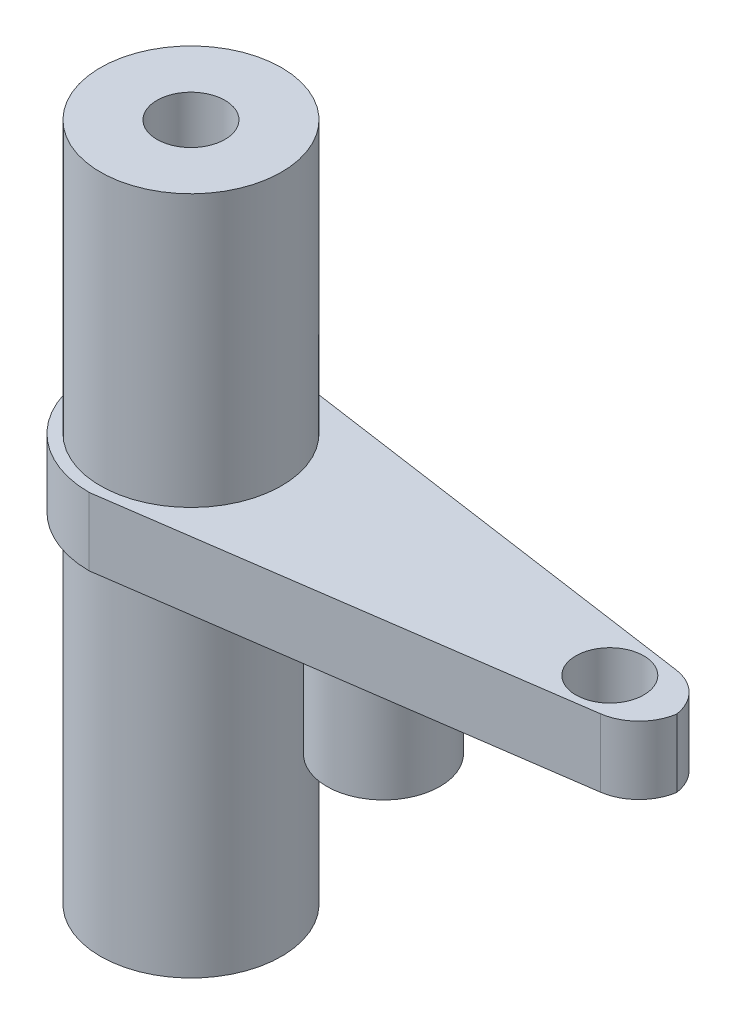
ISO-10303-21;
HEADER;
FILE_DESCRIPTION(('STEP AP214'),'2;1');
FILE_NAME('part.step','',(''),(''),'','','');
FILE_SCHEMA(('AUTOMOTIVE_DESIGN { 1 0 10303 214 1 1 1 1 }'));
ENDSEC;
DATA;
#1=APPLICATION_CONTEXT('core data for automotive mechanical design processes');
#2=APPLICATION_PROTOCOL_DEFINITION('international standard','automotive_design',2000,#1);
#3=PRODUCT_CONTEXT('',#1,'mechanical');
#4=PRODUCT('Part','Part','',(#3));
#5=PRODUCT_RELATED_PRODUCT_CATEGORY('part','',(#4));
#6=PRODUCT_DEFINITION_FORMATION('','',#4);
#7=PRODUCT_DEFINITION_CONTEXT('part definition',#1,'design');
#8=PRODUCT_DEFINITION('design','',#6,#7);
#9=PRODUCT_DEFINITION_SHAPE('','',#8);
#10=(LENGTH_UNIT() NAMED_UNIT(*) SI_UNIT(.MILLI.,.METRE.));
#11=(NAMED_UNIT(*) PLANE_ANGLE_UNIT() SI_UNIT($,.RADIAN.));
#12=(NAMED_UNIT(*) SI_UNIT($,.STERADIAN.) SOLID_ANGLE_UNIT());
#13=UNCERTAINTY_MEASURE_WITH_UNIT(LENGTH_MEASURE(1.E-05),#10,'distance_accuracy_value','');
#14=(GEOMETRIC_REPRESENTATION_CONTEXT(3) GLOBAL_UNCERTAINTY_ASSIGNED_CONTEXT((#13)) GLOBAL_UNIT_ASSIGNED_CONTEXT((#10,
#11,#12)) REPRESENTATION_CONTEXT('',''));
#15=CARTESIAN_POINT('',(0.,0.,0.));
#16=DIRECTION('',(0.,0.,1.));
#17=DIRECTION('',(1.,0.,0.));
#18=AXIS2_PLACEMENT_3D('',#15,#16,#17);
#19=CARTESIAN_POINT('',(0.,31.,0.));
#20=DIRECTION('',(0.,-1.,0.));
#21=DIRECTION('',(0.,0.,-1.));
#22=AXIS2_PLACEMENT_3D('',#19,#20,#21);
#23=CYLINDRICAL_SURFACE('',#22,4.);
#24=CARTESIAN_POINT('',(0.,18.,0.));
#25=DIRECTION('',(0.,1.,0.));
#26=DIRECTION('',(0.,0.,1.));
#27=AXIS2_PLACEMENT_3D('',#24,#25,#26);
#28=CIRCLE('',#27,4.);
#29=CARTESIAN_POINT('',(0.,18.,-4.));
#30=VERTEX_POINT('',#29);
#31=EDGE_CURVE('E146',#30,#30,#28,.T.);
#32=CARTESIAN_POINT('',(0.,30.,0.));
#33=DIRECTION('',(0.,1.,0.));
#34=DIRECTION('',(0.,0.,1.));
#35=AXIS2_PLACEMENT_3D('',#32,#33,#34);
#36=CIRCLE('',#35,4.);
#37=CARTESIAN_POINT('',(0.,30.,-4.));
#38=VERTEX_POINT('',#37);
#39=EDGE_CURVE('E226',#38,#38,#36,.T.);
#40=CARTESIAN_POINT('',(0.,18.,-4.));
#41=CARTESIAN_POINT('',(0.,18.125,-4.));
#42=CARTESIAN_POINT('',(0.,18.25,-4.));
#43=CARTESIAN_POINT('',(0.,18.5,-4.));
#44=CARTESIAN_POINT('',(0.,18.625,-4.));
#45=CARTESIAN_POINT('',(0.,18.875,-4.));
#46=CARTESIAN_POINT('',(0.,19.,-4.));
#47=CARTESIAN_POINT('',(0.,19.25,-4.));
#48=CARTESIAN_POINT('',(0.,19.375,-4.));
#49=CARTESIAN_POINT('',(0.,19.625,-4.));
#50=CARTESIAN_POINT('',(0.,19.75,-4.));
#51=CARTESIAN_POINT('',(0.,20.,-4.));
#52=CARTESIAN_POINT('',(0.,20.125,-4.));
#53=CARTESIAN_POINT('',(0.,20.375,-4.));
#54=CARTESIAN_POINT('',(0.,20.5,-4.));
#55=CARTESIAN_POINT('',(0.,20.75,-4.));
#56=CARTESIAN_POINT('',(0.,20.875,-4.));
#57=CARTESIAN_POINT('',(0.,21.125,-4.));
#58=CARTESIAN_POINT('',(0.,21.25,-4.));
#59=CARTESIAN_POINT('',(0.,21.5,-4.));
#60=CARTESIAN_POINT('',(0.,21.625,-4.));
#61=CARTESIAN_POINT('',(0.,21.875,-4.));
#62=CARTESIAN_POINT('',(0.,22.,-4.));
#63=CARTESIAN_POINT('',(0.,22.25,-4.));
#64=CARTESIAN_POINT('',(0.,22.375,-4.));
#65=CARTESIAN_POINT('',(0.,22.625,-4.));
#66=CARTESIAN_POINT('',(0.,22.75,-4.));
#67=CARTESIAN_POINT('',(0.,23.,-4.));
#68=CARTESIAN_POINT('',(0.,23.125,-4.));
#69=CARTESIAN_POINT('',(0.,23.375,-4.));
#70=CARTESIAN_POINT('',(0.,23.5,-4.));
#71=CARTESIAN_POINT('',(0.,23.75,-4.));
#72=CARTESIAN_POINT('',(0.,23.875,-4.));
#73=CARTESIAN_POINT('',(0.,24.125,-4.));
#74=CARTESIAN_POINT('',(0.,24.25,-4.));
#75=CARTESIAN_POINT('',(0.,24.5,-4.));
#76=CARTESIAN_POINT('',(0.,24.625,-4.));
#77=CARTESIAN_POINT('',(0.,24.875,-4.));
#78=CARTESIAN_POINT('',(0.,25.,-4.));
#79=CARTESIAN_POINT('',(0.,25.25,-4.));
#80=CARTESIAN_POINT('',(0.,25.375,-4.));
#81=CARTESIAN_POINT('',(0.,25.625,-4.));
#82=CARTESIAN_POINT('',(0.,25.75,-4.));
#83=CARTESIAN_POINT('',(0.,26.,-4.));
#84=CARTESIAN_POINT('',(0.,26.125,-4.));
#85=CARTESIAN_POINT('',(0.,26.375,-4.));
#86=CARTESIAN_POINT('',(0.,26.5,-4.));
#87=CARTESIAN_POINT('',(0.,26.75,-4.));
#88=CARTESIAN_POINT('',(0.,26.875,-4.));
#89=CARTESIAN_POINT('',(0.,27.125,-4.));
#90=CARTESIAN_POINT('',(0.,27.25,-4.));
#91=CARTESIAN_POINT('',(0.,27.5,-4.));
#92=CARTESIAN_POINT('',(0.,27.625,-4.));
#93=CARTESIAN_POINT('',(0.,27.875,-4.));
#94=CARTESIAN_POINT('',(0.,28.,-4.));
#95=CARTESIAN_POINT('',(0.,28.25,-4.));
#96=CARTESIAN_POINT('',(0.,28.375,-4.));
#97=CARTESIAN_POINT('',(0.,28.625,-4.));
#98=CARTESIAN_POINT('',(0.,28.75,-4.));
#99=CARTESIAN_POINT('',(0.,29.,-4.));
#100=CARTESIAN_POINT('',(0.,29.125,-4.));
#101=CARTESIAN_POINT('',(0.,29.375,-4.));
#102=CARTESIAN_POINT('',(0.,29.5,-4.));
#103=CARTESIAN_POINT('',(0.,29.75,-4.));
#104=CARTESIAN_POINT('',(0.,29.875,-4.));
#105=CARTESIAN_POINT('',(0.,30.,-4.));
#106=B_SPLINE_CURVE_WITH_KNOTS('',3,(#40,#41,#42,#43,#44,#45,#46,#47,#48,#49,#50,#51,#52,#53,
#54,#55,#56,#57,#58,#59,#60,#61,#62,#63,#64,#65,#66,#67,#68,#69,#70,#71,#72,#73,#74,#75,#76,#77,
#78,#79,#80,#81,#82,#83,#84,#85,#86,#87,#88,#89,#90,#91,#92,#93,#94,#95,#96,#97,#98,#99,#100,
#101,#102,#103,#104,#105),.UNSPECIFIED.,.F.,.F.,(4,2,2,2,2,2,2,2,2,2,2,2,2,2,2,2,2,2,2,2,2,2,2,
2,2,2,2,2,2,2,2,2,4),(0.,0.375,0.750000000000001,1.125,1.5,1.875,2.25,2.625,3.,3.375,3.75,4.125,
4.5,4.875,5.25,5.625,6.,6.375,6.75,7.125,7.5,7.875,8.25,8.625,9.,9.375,9.75,10.125,10.5,10.875,
11.25,11.625,12.),.UNSPECIFIED.);
#107=EDGE_CURVE('BSEAM44',#30,#38,#106,.T.);
#108=ORIENTED_EDGE('',*,*,#31,.T.);
#109=ORIENTED_EDGE('',*,*,#39,.F.);
#110=ORIENTED_EDGE('',*,*,#107,.T.);
#111=ORIENTED_EDGE('',*,*,#107,.F.);
#112=EDGE_LOOP('',(#108,#110,#109,#111));
#113=FACE_BOUND('',#112,.T.);
#114=ADVANCED_FACE('F44',(#113),#23,.T.);
#115=CARTESIAN_POINT('',(0.,15.,0.));
#116=DIRECTION('',(0.,-1.,0.));
#117=DIRECTION('',(0.,0.,-1.));
#118=AXIS2_PLACEMENT_3D('',#115,#116,#117);
#119=CYLINDRICAL_SURFACE('',#118,4.);
#120=CARTESIAN_POINT('',(0.,15.,0.));
#121=DIRECTION('',(0.,1.,0.));
#122=DIRECTION('',(0.,0.,1.));
#123=AXIS2_PLACEMENT_3D('',#120,#121,#122);
#124=CIRCLE('',#123,4.);
#125=CARTESIAN_POINT('',(0.,15.,4.));
#126=VERTEX_POINT('',#125);
#127=EDGE_CURVE('E131',#126,#126,#124,.T.);
#128=ORIENTED_EDGE('',*,*,#127,.F.);
#129=EDGE_LOOP('',(#128));
#130=FACE_BOUND('',#129,.T.);
#131=CARTESIAN_POINT('',(0.,0.,0.));
#132=DIRECTION('',(0.,1.,0.));
#133=DIRECTION('',(0.,0.,1.));
#134=AXIS2_PLACEMENT_3D('',#131,#132,#133);
#135=CIRCLE('',#134,4.);
#136=CARTESIAN_POINT('',(0.,0.,4.));
#137=VERTEX_POINT('',#136);
#138=EDGE_CURVE('E104',#137,#137,#135,.T.);
#139=ORIENTED_EDGE('',*,*,#138,.T.);
#140=EDGE_LOOP('',(#139));
#141=FACE_BOUND('',#140,.T.);
#142=ADVANCED_FACE('F176',(#130,#141),#119,.T.);
#143=CARTESIAN_POINT('',(0.,0.,0.));
#144=DIRECTION('',(0.,1.,0.));
#145=DIRECTION('',(0.,0.,1.));
#146=AXIS2_PLACEMENT_3D('',#143,#144,#145);
#147=PLANE('',#146);
#148=CARTESIAN_POINT('',(0.,0.,0.));
#149=DIRECTION('',(0.,-1.,0.));
#150=DIRECTION('',(0.,0.,-1.));
#151=AXIS2_PLACEMENT_3D('',#148,#149,#150);
#152=CIRCLE('',#151,1.25);
#153=CARTESIAN_POINT('',(0.,0.,-1.25));
#154=VERTEX_POINT('',#153);
#155=EDGE_CURVE('E241',#154,#154,#152,.T.);
#156=ORIENTED_EDGE('',*,*,#155,.F.);
#157=EDGE_LOOP('',(#156));
#158=FACE_BOUND('',#157,.T.);
#159=ORIENTED_EDGE('',*,*,#138,.F.);
#160=EDGE_LOOP('',(#159));
#161=FACE_BOUND('',#160,.T.);
#162=ADVANCED_FACE('F180',(#158,#161),#147,.F.);
#163=CARTESIAN_POINT('',(0.63070691294548,18.,4.40979369152769));
#164=DIRECTION('',(-0.141583354696734,0.,-0.98992633749831));
#165=DIRECTION('',(-0.989926337498311,0.,0.141583354696734));
#166=AXIS2_PLACEMENT_3D('',#163,#164,#165);
#167=PLANE('',#166);
#168=DIRECTION('',(0.98992633749831,0.,-0.141583354696734));
#169=VECTOR('',#168,1.);
#170=CARTESIAN_POINT('',(0.63070691294548,15.,4.40979369152769));
#171=LINE('',#170,#169);
#172=CARTESIAN_POINT('',(0.,15.,4.5));
#173=VERTEX_POINT('',#172);
#174=CARTESIAN_POINT('',(19.7642918810101,15.,1.67322931846573));
#175=VERTEX_POINT('',#174);
#176=EDGE_CURVE('E124',#173,#175,#171,.T.);
#177=ORIENTED_EDGE('',*,*,#176,.T.);
#178=DIRECTION('',(0.,-1.,0.));
#179=VECTOR('',#178,1.);
#180=CARTESIAN_POINT('',(19.7642918810101,18.,1.67322931846573));
#181=LINE('',#180,#179);
#182=CARTESIAN_POINT('',(19.7642918810101,18.,1.67322931846573));
#183=VERTEX_POINT('',#182);
#184=EDGE_CURVE('E53',#175,#183,#181,.F.);
#185=ORIENTED_EDGE('',*,*,#184,.T.);
#186=DIRECTION('',(0.98992633749831,0.,-0.141583354696734));
#187=VECTOR('',#186,1.);
#188=CARTESIAN_POINT('',(0.63070691294548,18.,4.40979369152769));
#189=LINE('',#188,#187);
#190=CARTESIAN_POINT('',(0.,18.,4.5));
#191=VERTEX_POINT('',#190);
#192=EDGE_CURVE('E115',#191,#183,#189,.T.);
#193=ORIENTED_EDGE('',*,*,#192,.F.);
#194=DIRECTION('',(0.,-1.,0.));
#195=VECTOR('',#194,1.);
#196=CARTESIAN_POINT('',(0.,18.,4.5));
#197=LINE('',#196,#195);
#198=EDGE_CURVE('E105',#191,#173,#197,.T.);
#199=ORIENTED_EDGE('',*,*,#198,.T.);
#200=EDGE_LOOP('',(#177,#185,#193,#199));
#201=FACE_BOUND('',#200,.T.);
#202=ADVANCED_FACE('F249',(#201),#167,.F.);
#203=CARTESIAN_POINT('',(0.630706912945477,18.,-4.40979369152768));
#204=DIRECTION('',(0.141583354696733,0.,-0.98992633749831));
#205=DIRECTION('',(-0.989926337498311,0.,-0.141583354696733));
#206=AXIS2_PLACEMENT_3D('',#203,#204,#205);
#207=PLANE('',#206);
#208=DIRECTION('',(0.989926337498311,0.,0.141583354696733));
#209=VECTOR('',#208,1.);
#210=CARTESIAN_POINT('',(0.630706912945477,18.,-4.40979369152768));
#211=LINE('',#210,#209);
#212=CARTESIAN_POINT('',(0.,18.,-4.5));
#213=VERTEX_POINT('',#212);
#214=CARTESIAN_POINT('',(19.7642918810101,18.,-1.67322931846573));
#215=VERTEX_POINT('',#214);
#216=EDGE_CURVE('E98',#213,#215,#211,.T.);
#217=ORIENTED_EDGE('',*,*,#216,.T.);
#218=DIRECTION('',(0.,1.,0.));
#219=VECTOR('',#218,1.);
#220=CARTESIAN_POINT('',(19.7642918810101,15.,-1.67322931846573));
#221=LINE('',#220,#219);
#222=CARTESIAN_POINT('',(19.7642918810101,15.,-1.67322931846573));
#223=VERTEX_POINT('',#222);
#224=EDGE_CURVE('E134',#215,#223,#221,.F.);
#225=ORIENTED_EDGE('',*,*,#224,.T.);
#226=DIRECTION('',(0.989926337498311,0.,0.141583354696733));
#227=VECTOR('',#226,1.);
#228=CARTESIAN_POINT('',(0.630706912945477,15.,-4.40979369152768));
#229=LINE('',#228,#227);
#230=CARTESIAN_POINT('',(0.,15.,-4.5));
#231=VERTEX_POINT('',#230);
#232=EDGE_CURVE('E101',#231,#223,#229,.T.);
#233=ORIENTED_EDGE('',*,*,#232,.F.);
#234=DIRECTION('',(0.,-1.,0.));
#235=VECTOR('',#234,1.);
#236=CARTESIAN_POINT('',(0.,18.,-4.5));
#237=LINE('',#236,#235);
#238=EDGE_CURVE('E93',#213,#231,#237,.T.);
#239=ORIENTED_EDGE('',*,*,#238,.F.);
#240=EDGE_LOOP('',(#217,#225,#233,#239));
#241=FACE_BOUND('',#240,.T.);
#242=ADVANCED_FACE('F95',(#241),#207,.T.);
#243=CARTESIAN_POINT('',(18.5,18.,0.));
#244=DIRECTION('',(0.,-1.,0.));
#245=DIRECTION('',(0.,0.,-1.));
#246=AXIS2_PLACEMENT_3D('',#243,#244,#245);
#247=CYLINDRICAL_SURFACE('',#246,1.5);
#248=CARTESIAN_POINT('',(18.5,18.,0.));
#249=DIRECTION('',(0.,1.,0.));
#250=DIRECTION('',(0.,0.,1.));
#251=AXIS2_PLACEMENT_3D('',#248,#249,#250);
#252=CIRCLE('',#251,1.5);
#253=CARTESIAN_POINT('',(18.5,18.,1.5));
#254=VERTEX_POINT('',#253);
#255=EDGE_CURVE('E117',#254,#254,#252,.T.);
#256=ORIENTED_EDGE('',*,*,#255,.T.);
#257=EDGE_LOOP('',(#256));
#258=FACE_BOUND('',#257,.T.);
#259=CARTESIAN_POINT('',(18.5,15.,0.));
#260=DIRECTION('',(0.,1.,0.));
#261=DIRECTION('',(0.,0.,1.));
#262=AXIS2_PLACEMENT_3D('',#259,#260,#261);
#263=CIRCLE('',#262,1.5);
#264=CARTESIAN_POINT('',(18.5,15.,1.5));
#265=VERTEX_POINT('',#264);
#266=EDGE_CURVE('E121',#265,#265,#263,.T.);
#267=ORIENTED_EDGE('',*,*,#266,.F.);
#268=EDGE_LOOP('',(#267));
#269=FACE_BOUND('',#268,.T.);
#270=ADVANCED_FACE('F160',(#258,#269),#247,.F.);
#271=CARTESIAN_POINT('',(0.,18.,0.));
#272=DIRECTION('',(0.,-1.,0.));
#273=DIRECTION('',(0.,0.,-1.));
#274=AXIS2_PLACEMENT_3D('',#271,#272,#273);
#275=CYLINDRICAL_SURFACE('',#274,4.5);
#276=CARTESIAN_POINT('',(0.,15.,0.));
#277=DIRECTION('',(0.,1.,0.));
#278=DIRECTION('',(0.,0.,1.));
#279=AXIS2_PLACEMENT_3D('',#276,#277,#278);
#280=CIRCLE('',#279,4.5);
#281=EDGE_CURVE('E128',#231,#173,#280,.T.);
#282=ORIENTED_EDGE('',*,*,#281,.T.);
#283=ORIENTED_EDGE('',*,*,#198,.F.);
#284=CARTESIAN_POINT('',(0.,18.,0.));
#285=DIRECTION('',(0.,1.,0.));
#286=DIRECTION('',(0.,0.,1.));
#287=AXIS2_PLACEMENT_3D('',#284,#285,#286);
#288=CIRCLE('',#287,4.5);
#289=EDGE_CURVE('E108',#213,#191,#288,.T.);
#290=ORIENTED_EDGE('',*,*,#289,.F.);
#291=ORIENTED_EDGE('',*,*,#238,.T.);
#292=EDGE_LOOP('',(#282,#283,#290,#291));
#293=FACE_BOUND('',#292,.T.);
#294=ADVANCED_FACE('F109',(#293),#275,.T.);
#295=CARTESIAN_POINT('',(0.,18.,0.));
#296=DIRECTION('',(0.,1.,0.));
#297=DIRECTION('',(0.,0.,1.));
#298=AXIS2_PLACEMENT_3D('',#295,#296,#297);
#299=PLANE('',#298);
#300=ORIENTED_EDGE('',*,*,#31,.F.);
#301=EDGE_LOOP('',(#300));
#302=FACE_BOUND('',#301,.T.);
#303=ORIENTED_EDGE('',*,*,#255,.F.);
#304=EDGE_LOOP('',(#303));
#305=FACE_BOUND('',#304,.T.);
#306=CARTESIAN_POINT('',(19.4811251716166,18.,-0.306623356530893));
#307=DIRECTION('',(0.,1.,0.));
#308=DIRECTION('',(0.,0.,1.));
#309=AXIS2_PLACEMENT_3D('',#306,#307,#308);
#310=CIRCLE('',#309,2.);
#311=CARTESIAN_POINT('',(21.457480938484,18.,0.));
#312=VERTEX_POINT('',#311);
#313=EDGE_CURVE('E60',#183,#312,#310,.T.);
#314=ORIENTED_EDGE('',*,*,#313,.T.);
#315=CARTESIAN_POINT('',(19.4811251716166,18.,0.306623356530893));
#316=DIRECTION('',(0.,1.,0.));
#317=DIRECTION('',(0.,0.,1.));
#318=AXIS2_PLACEMENT_3D('',#315,#316,#317);
#319=CIRCLE('',#318,2.);
#320=EDGE_CURVE('E114',#312,#215,#319,.T.);
#321=ORIENTED_EDGE('',*,*,#320,.T.);
#322=ORIENTED_EDGE('',*,*,#216,.F.);
#323=ORIENTED_EDGE('',*,*,#289,.T.);
#324=ORIENTED_EDGE('',*,*,#192,.T.);
#325=EDGE_LOOP('',(#314,#321,#322,#323,#324));
#326=FACE_BOUND('',#325,.T.);
#327=ADVANCED_FACE('F112',(#302,#305,#326),#299,.T.);
#328=CARTESIAN_POINT('',(0.,15.,0.));
#329=DIRECTION('',(0.,1.,0.));
#330=DIRECTION('',(0.,0.,1.));
#331=AXIS2_PLACEMENT_3D('',#328,#329,#330);
#332=PLANE('',#331);
#333=CARTESIAN_POINT('',(8.5,15.,0.));
#334=DIRECTION('',(0.,1.,0.));
#335=DIRECTION('',(0.,0.,1.));
#336=AXIS2_PLACEMENT_3D('',#333,#334,#335);
#337=CIRCLE('',#336,2.5);
#338=CARTESIAN_POINT('',(8.5,15.,2.5));
#339=VERTEX_POINT('',#338);
#340=EDGE_CURVE('E11',#339,#339,#337,.F.);
#341=ORIENTED_EDGE('',*,*,#340,.F.);
#342=EDGE_LOOP('',(#341));
#343=FACE_BOUND('',#342,.T.);
#344=ORIENTED_EDGE('',*,*,#127,.T.);
#345=EDGE_LOOP('',(#344));
#346=FACE_BOUND('',#345,.T.);
#347=ORIENTED_EDGE('',*,*,#266,.T.);
#348=EDGE_LOOP('',(#347));
#349=FACE_BOUND('',#348,.T.);
#350=ORIENTED_EDGE('',*,*,#232,.T.);
#351=CARTESIAN_POINT('',(19.4811251716166,15.,0.306623356530893));
#352=DIRECTION('',(0.,1.,0.));
#353=DIRECTION('',(0.,0.,1.));
#354=AXIS2_PLACEMENT_3D('',#351,#352,#353);
#355=CIRCLE('',#354,2.);
#356=CARTESIAN_POINT('',(21.457480938484,15.,0.));
#357=VERTEX_POINT('',#356);
#358=EDGE_CURVE('E140',#223,#357,#355,.F.);
#359=ORIENTED_EDGE('',*,*,#358,.T.);
#360=CARTESIAN_POINT('',(19.4811251716166,15.,-0.306623356530893));
#361=DIRECTION('',(0.,1.,0.));
#362=DIRECTION('',(0.,0.,1.));
#363=AXIS2_PLACEMENT_3D('',#360,#361,#362);
#364=CIRCLE('',#363,2.);
#365=EDGE_CURVE('E138',#357,#175,#364,.F.);
#366=ORIENTED_EDGE('',*,*,#365,.T.);
#367=ORIENTED_EDGE('',*,*,#176,.F.);
#368=ORIENTED_EDGE('',*,*,#281,.F.);
#369=EDGE_LOOP('',(#350,#359,#366,#367,#368));
#370=FACE_BOUND('',#369,.T.);
#371=ADVANCED_FACE('F164',(#343,#346,#349,#370),#332,.F.);
#372=CARTESIAN_POINT('',(19.4811251716166,18.,-0.306623356530893));
#373=DIRECTION('',(0.,-1.,0.));
#374=DIRECTION('',(0.,0.,-1.));
#375=AXIS2_PLACEMENT_3D('',#372,#373,#374);
#376=CYLINDRICAL_SURFACE('',#375,2.);
#377=DIRECTION('',(0.,-1.,0.));
#378=VECTOR('',#377,1.);
#379=CARTESIAN_POINT('',(21.457480938484,16.5,0.));
#380=LINE('',#379,#378);
#381=EDGE_CURVE('E125',#312,#357,#380,.T.);
#382=ORIENTED_EDGE('',*,*,#381,.F.);
#383=ORIENTED_EDGE('',*,*,#313,.F.);
#384=ORIENTED_EDGE('',*,*,#184,.F.);
#385=ORIENTED_EDGE('',*,*,#365,.F.);
#386=EDGE_LOOP('',(#382,#383,#384,#385));
#387=FACE_BOUND('',#386,.T.);
#388=ADVANCED_FACE('F46',(#387),#376,.T.);
#389=CARTESIAN_POINT('',(19.4811251716166,18.,0.306623356530893));
#390=DIRECTION('',(0.,-1.,0.));
#391=DIRECTION('',(0.,0.,-1.));
#392=AXIS2_PLACEMENT_3D('',#389,#390,#391);
#393=CYLINDRICAL_SURFACE('',#392,2.);
#394=ORIENTED_EDGE('',*,*,#320,.F.);
#395=ORIENTED_EDGE('',*,*,#381,.T.);
#396=ORIENTED_EDGE('',*,*,#358,.F.);
#397=ORIENTED_EDGE('',*,*,#224,.F.);
#398=EDGE_LOOP('',(#394,#395,#396,#397));
#399=FACE_BOUND('',#398,.T.);
#400=ADVANCED_FACE('F198',(#399),#393,.T.);
#401=CARTESIAN_POINT('',(0.,10.,0.));
#402=DIRECTION('',(0.,-1.,0.));
#403=DIRECTION('',(0.,0.,-1.));
#404=AXIS2_PLACEMENT_3D('',#401,#402,#403);
#405=CYLINDRICAL_SURFACE('',#404,1.25);
#406=CARTESIAN_POINT('',(0.,10.,0.));
#407=DIRECTION('',(0.,-1.,0.));
#408=DIRECTION('',(0.,0.,-1.));
#409=AXIS2_PLACEMENT_3D('',#406,#407,#408);
#410=CIRCLE('',#409,1.25);
#411=CARTESIAN_POINT('',(0.,10.,-1.25));
#412=VERTEX_POINT('',#411);
#413=EDGE_CURVE('E154',#412,#412,#410,.T.);
#414=ORIENTED_EDGE('',*,*,#413,.F.);
#415=EDGE_LOOP('',(#414));
#416=FACE_BOUND('',#415,.T.);
#417=ORIENTED_EDGE('',*,*,#155,.T.);
#418=EDGE_LOOP('',(#417));
#419=FACE_BOUND('',#418,.T.);
#420=ADVANCED_FACE('F194',(#416,#419),#405,.F.);
#421=CARTESIAN_POINT('',(0.,10.,0.));
#422=DIRECTION('',(0.,-1.,0.));
#423=DIRECTION('',(0.,0.,-1.));
#424=AXIS2_PLACEMENT_3D('',#421,#422,#423);
#425=PLANE('',#424);
#426=ORIENTED_EDGE('',*,*,#413,.T.);
#427=EDGE_LOOP('',(#426));
#428=FACE_BOUND('',#427,.T.);
#429=ADVANCED_FACE('F197',(#428),#425,.T.);
#430=CARTESIAN_POINT('',(8.5,10.,0.));
#431=DIRECTION('',(0.,1.,0.));
#432=DIRECTION('',(0.,0.,1.));
#433=AXIS2_PLACEMENT_3D('',#430,#431,#432);
#434=CYLINDRICAL_SURFACE('',#433,2.5);
#435=CARTESIAN_POINT('',(8.5,10.,0.));
#436=DIRECTION('',(0.,-1.,0.));
#437=DIRECTION('',(0.,0.,-1.));
#438=AXIS2_PLACEMENT_3D('',#435,#436,#437);
#439=CIRCLE('',#438,2.5);
#440=CARTESIAN_POINT('',(8.5,10.,-2.5));
#441=VERTEX_POINT('',#440);
#442=EDGE_CURVE('E237',#441,#441,#439,.T.);
#443=ORIENTED_EDGE('',*,*,#442,.F.);
#444=EDGE_LOOP('',(#443));
#445=FACE_BOUND('',#444,.T.);
#446=ORIENTED_EDGE('',*,*,#340,.T.);
#447=EDGE_LOOP('',(#446));
#448=FACE_BOUND('',#447,.T.);
#449=ADVANCED_FACE('F202',(#445,#448),#434,.T.);
#450=CARTESIAN_POINT('',(8.5,10.,0.));
#451=DIRECTION('',(0.,-1.,0.));
#452=DIRECTION('',(0.,0.,-1.));
#453=AXIS2_PLACEMENT_3D('',#450,#451,#452);
#454=PLANE('',#453);
#455=CARTESIAN_POINT('',(8.5,10.,0.));
#456=DIRECTION('',(0.,-1.,0.));
#457=DIRECTION('',(0.,0.,-1.));
#458=AXIS2_PLACEMENT_3D('',#455,#456,#457);
#459=CIRCLE('',#458,1.25);
#460=CARTESIAN_POINT('',(8.5,10.,-1.25));
#461=VERTEX_POINT('',#460);
#462=EDGE_CURVE('E230',#461,#461,#459,.T.);
#463=ORIENTED_EDGE('',*,*,#462,.F.);
#464=EDGE_LOOP('',(#463));
#465=FACE_BOUND('',#464,.T.);
#466=ORIENTED_EDGE('',*,*,#442,.T.);
#467=EDGE_LOOP('',(#466));
#468=FACE_BOUND('',#467,.T.);
#469=ADVANCED_FACE('F206',(#465,#468),#454,.T.);
#470=CARTESIAN_POINT('',(8.5,15.,0.));
#471=DIRECTION('',(0.,-1.,0.));
#472=DIRECTION('',(0.,0.,-1.));
#473=AXIS2_PLACEMENT_3D('',#470,#471,#472);
#474=CYLINDRICAL_SURFACE('',#473,1.25);
#475=CARTESIAN_POINT('',(8.5,15.,0.));
#476=DIRECTION('',(0.,-1.,0.));
#477=DIRECTION('',(0.,0.,-1.));
#478=AXIS2_PLACEMENT_3D('',#475,#476,#477);
#479=CIRCLE('',#478,1.25);
#480=CARTESIAN_POINT('',(8.5,15.,-1.25));
#481=VERTEX_POINT('',#480);
#482=EDGE_CURVE('E232',#481,#481,#479,.T.);
#483=ORIENTED_EDGE('',*,*,#482,.F.);
#484=EDGE_LOOP('',(#483));
#485=FACE_BOUND('',#484,.T.);
#486=ORIENTED_EDGE('',*,*,#462,.T.);
#487=EDGE_LOOP('',(#486));
#488=FACE_BOUND('',#487,.T.);
#489=ADVANCED_FACE('F210',(#485,#488),#474,.F.);
#490=CARTESIAN_POINT('',(8.5,15.,0.));
#491=DIRECTION('',(0.,-1.,0.));
#492=DIRECTION('',(0.,0.,-1.));
#493=AXIS2_PLACEMENT_3D('',#490,#491,#492);
#494=PLANE('',#493);
#495=ORIENTED_EDGE('',*,*,#482,.T.);
#496=EDGE_LOOP('',(#495));
#497=FACE_BOUND('',#496,.T.);
#498=ADVANCED_FACE('F214',(#497),#494,.T.);
#499=CARTESIAN_POINT('',(0.,30.,0.));
#500=DIRECTION('',(0.,1.,0.));
#501=DIRECTION('',(0.,0.,1.));
#502=AXIS2_PLACEMENT_3D('',#499,#500,#501);
#503=PLANE('',#502);
#504=ORIENTED_EDGE('',*,*,#39,.T.);
#505=EDGE_LOOP('',(#504));
#506=FACE_BOUND('',#505,.T.);
#507=CARTESIAN_POINT('',(0.,30.,0.));
#508=DIRECTION('',(0.,1.,0.));
#509=DIRECTION('',(0.,0.,1.));
#510=AXIS2_PLACEMENT_3D('',#507,#508,#509);
#511=CIRCLE('',#510,1.5);
#512=CARTESIAN_POINT('',(0.,30.,1.5));
#513=VERTEX_POINT('',#512);
#514=EDGE_CURVE('E48',#513,#513,#511,.F.);
#515=ORIENTED_EDGE('',*,*,#514,.T.);
#516=EDGE_LOOP('',(#515));
#517=FACE_BOUND('',#516,.T.);
#518=ADVANCED_FACE('F192',(#506,#517),#503,.T.);
#519=CARTESIAN_POINT('',(0.,21.,0.));
#520=DIRECTION('',(0.,1.,0.));
#521=DIRECTION('',(0.,0.,1.));
#522=AXIS2_PLACEMENT_3D('',#519,#520,#521);
#523=PLANE('',#522);
#524=CARTESIAN_POINT('',(0.,21.,0.));
#525=DIRECTION('',(0.,1.,0.));
#526=DIRECTION('',(0.,0.,1.));
#527=AXIS2_PLACEMENT_3D('',#524,#525,#526);
#528=CIRCLE('',#527,1.5);
#529=CARTESIAN_POINT('',(0.,21.,1.5));
#530=VERTEX_POINT('',#529);
#531=EDGE_CURVE('E149',#530,#530,#528,.T.);
#532=ORIENTED_EDGE('',*,*,#531,.T.);
#533=EDGE_LOOP('',(#532));
#534=FACE_BOUND('',#533,.T.);
#535=ADVANCED_FACE('F188',(#534),#523,.T.);
#536=CARTESIAN_POINT('',(0.,21.,0.));
#537=DIRECTION('',(0.,1.,0.));
#538=DIRECTION('',(0.,0.,1.));
#539=AXIS2_PLACEMENT_3D('',#536,#537,#538);
#540=CYLINDRICAL_SURFACE('',#539,1.5);
#541=ORIENTED_EDGE('',*,*,#531,.F.);
#542=EDGE_LOOP('',(#541));
#543=FACE_BOUND('',#542,.T.);
#544=ORIENTED_EDGE('',*,*,#514,.F.);
#545=EDGE_LOOP('',(#544));
#546=FACE_BOUND('',#545,.T.);
#547=ADVANCED_FACE('F185',(#543,#546),#540,.F.);
#548=CLOSED_SHELL('',(#114,#142,#162,#202,#242,#270,#294,#327,#371,#388,#400,#420,#429,#449,
#469,#489,#498,#518,#535,#547));
#549=MANIFOLD_SOLID_BREP('B2',#548);
#550=ADVANCED_BREP_SHAPE_REPRESENTATION('',(#18,#549),#14);
#551=SHAPE_DEFINITION_REPRESENTATION(#9,#550);
ENDSEC;
END-ISO-10303-21;
